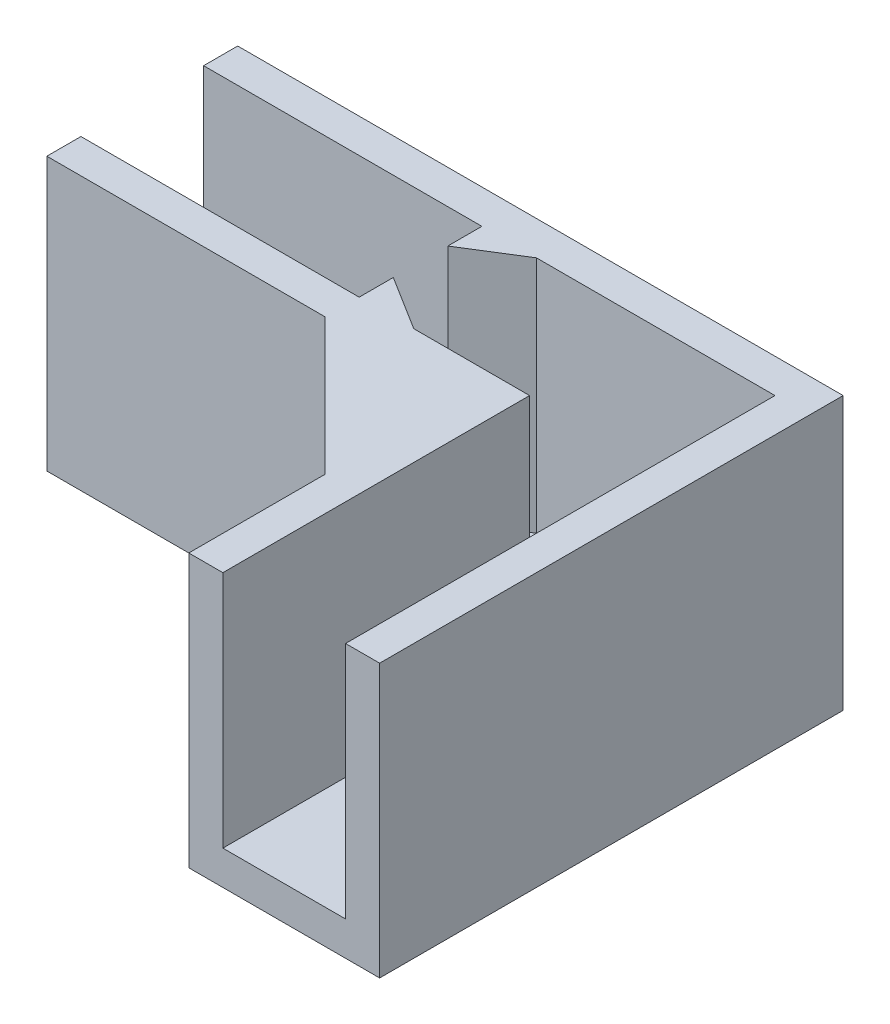
ISO-10303-21;
HEADER;
FILE_DESCRIPTION(('STEP AP214'),'2;1');
FILE_NAME('part.step','',(''),(''),'','','');
FILE_SCHEMA(('AUTOMOTIVE_DESIGN { 1 0 10303 214 1 1 1 1 }'));
ENDSEC;
DATA;
#1=APPLICATION_CONTEXT('core data for automotive mechanical design processes');
#2=APPLICATION_PROTOCOL_DEFINITION('international standard','automotive_design',2000,#1);
#3=PRODUCT_CONTEXT('',#1,'mechanical');
#4=PRODUCT('Part','Part','',(#3));
#5=PRODUCT_RELATED_PRODUCT_CATEGORY('part','',(#4));
#6=PRODUCT_DEFINITION_FORMATION('','',#4);
#7=PRODUCT_DEFINITION_CONTEXT('part definition',#1,'design');
#8=PRODUCT_DEFINITION('design','',#6,#7);
#9=PRODUCT_DEFINITION_SHAPE('','',#8);
#10=(LENGTH_UNIT() NAMED_UNIT(*) SI_UNIT(.MILLI.,.METRE.));
#11=(NAMED_UNIT(*) PLANE_ANGLE_UNIT() SI_UNIT($,.RADIAN.));
#12=(NAMED_UNIT(*) SI_UNIT($,.STERADIAN.) SOLID_ANGLE_UNIT());
#13=UNCERTAINTY_MEASURE_WITH_UNIT(LENGTH_MEASURE(1.E-05),#10,'distance_accuracy_value','');
#14=(GEOMETRIC_REPRESENTATION_CONTEXT(3) GLOBAL_UNCERTAINTY_ASSIGNED_CONTEXT((#13)) GLOBAL_UNIT_ASSIGNED_CONTEXT((#10,
#11,#12)) REPRESENTATION_CONTEXT('',''));
#15=CARTESIAN_POINT('',(0.,0.,0.));
#16=DIRECTION('',(0.,0.,1.));
#17=DIRECTION('',(1.,0.,0.));
#18=AXIS2_PLACEMENT_3D('',#15,#16,#17);
#19=CARTESIAN_POINT('',(-9.,5.,-9.));
#20=DIRECTION('',(0.,0.,-1.));
#21=DIRECTION('',(-1.,0.,0.));
#22=AXIS2_PLACEMENT_3D('',#19,#20,#21);
#23=PLANE('',#22);
#24=DIRECTION('',(-1.,0.,0.));
#25=VECTOR('',#24,1.);
#26=CARTESIAN_POINT('',(9.,5.,-9.));
#27=LINE('',#26,#25);
#28=CARTESIAN_POINT('',(-34.,5.,-9.));
#29=VERTEX_POINT('',#28);
#30=CARTESIAN_POINT('',(-74.8225344136131,5.,-8.99999999999998));
#31=VERTEX_POINT('',#30);
#32=EDGE_CURVE('E245',#29,#31,#27,.T.);
#33=ORIENTED_EDGE('',*,*,#32,.F.);
#34=DIRECTION('',(0.,1.,0.));
#35=VECTOR('',#34,1.);
#36=CARTESIAN_POINT('',(-34.,0.,-8.99999999999999));
#37=LINE('',#36,#35);
#38=CARTESIAN_POINT('',(-34.,40.,-8.99999999999999));
#39=VERTEX_POINT('',#38);
#40=EDGE_CURVE('E55',#29,#39,#37,.T.);
#41=ORIENTED_EDGE('',*,*,#40,.T.);
#42=DIRECTION('',(-1.,0.,0.));
#43=VECTOR('',#42,1.);
#44=CARTESIAN_POINT('',(-9.,40.,-9.));
#45=LINE('',#44,#43);
#46=CARTESIAN_POINT('',(-74.8225344136131,40.,-8.99999999999998));
#47=VERTEX_POINT('',#46);
#48=EDGE_CURVE('E191',#39,#47,#45,.T.);
#49=ORIENTED_EDGE('',*,*,#48,.T.);
#50=DIRECTION('',(0.,1.,0.));
#51=VECTOR('',#50,1.);
#52=CARTESIAN_POINT('',(-74.8225344136131,5.,-8.99999999999998));
#53=LINE('',#52,#51);
#54=EDGE_CURVE('E277',#31,#47,#53,.T.);
#55=ORIENTED_EDGE('',*,*,#54,.F.);
#56=EDGE_LOOP('',(#33,#41,#49,#55));
#57=FACE_BOUND('',#56,.T.);
#58=ADVANCED_FACE('F39',(#57),#23,.F.);
#59=CARTESIAN_POINT('',(-9.,5.,9.));
#60=DIRECTION('',(0.,0.,1.));
#61=DIRECTION('',(1.,0.,0.));
#62=AXIS2_PLACEMENT_3D('',#59,#60,#61);
#63=PLANE('',#62);
#64=DIRECTION('',(1.,0.,0.));
#65=VECTOR('',#64,1.);
#66=CARTESIAN_POINT('',(-9.,40.,9.));
#67=LINE('',#66,#65);
#68=CARTESIAN_POINT('',(-74.8225344136131,40.,9.00000000000001));
#69=VERTEX_POINT('',#68);
#70=CARTESIAN_POINT('',(-34.,40.,9.00000000000001));
#71=VERTEX_POINT('',#70);
#72=EDGE_CURVE('E238',#69,#71,#67,.T.);
#73=ORIENTED_EDGE('',*,*,#72,.T.);
#74=DIRECTION('',(0.,1.,0.));
#75=VECTOR('',#74,1.);
#76=CARTESIAN_POINT('',(-34.,0.,9.00000000000001));
#77=LINE('',#76,#75);
#78=CARTESIAN_POINT('',(-34.,5.,9.00000000000001));
#79=VERTEX_POINT('',#78);
#80=EDGE_CURVE('E208',#79,#71,#77,.T.);
#81=ORIENTED_EDGE('',*,*,#80,.F.);
#82=DIRECTION('',(1.,0.,0.));
#83=VECTOR('',#82,1.);
#84=CARTESIAN_POINT('',(-9.,5.,9.));
#85=LINE('',#84,#83);
#86=CARTESIAN_POINT('',(-74.8225344136131,5.,9.00000000000001));
#87=VERTEX_POINT('',#86);
#88=EDGE_CURVE('E253',#87,#79,#85,.T.);
#89=ORIENTED_EDGE('',*,*,#88,.F.);
#90=DIRECTION('',(0.,1.,0.));
#91=VECTOR('',#90,1.);
#92=CARTESIAN_POINT('',(-74.8225344136131,5.,9.00000000000001));
#93=LINE('',#92,#91);
#94=EDGE_CURVE('E274',#87,#69,#93,.T.);
#95=ORIENTED_EDGE('',*,*,#94,.T.);
#96=EDGE_LOOP('',(#73,#81,#89,#95));
#97=FACE_BOUND('',#96,.T.);
#98=ADVANCED_FACE('F377',(#97),#63,.F.);
#99=CARTESIAN_POINT('',(0.,40.,0.));
#100=DIRECTION('',(0.,1.,0.));
#101=DIRECTION('',(0.,0.,1.));
#102=AXIS2_PLACEMENT_3D('',#99,#100,#101);
#103=PLANE('',#102);
#104=DIRECTION('',(1.,0.,0.));
#105=VECTOR('',#104,1.);
#106=CARTESIAN_POINT('',(-14.,40.,14.));
#107=LINE('',#106,#105);
#108=CARTESIAN_POINT('',(-74.8225344136131,40.,14.));
#109=VERTEX_POINT('',#108);
#110=CARTESIAN_POINT('',(-34.,40.,14.));
#111=VERTEX_POINT('',#110);
#112=EDGE_CURVE('E299',#109,#111,#107,.T.);
#113=ORIENTED_EDGE('',*,*,#112,.T.);
#114=DIRECTION('',(0.707106781186548,0.,0.707106781186547));
#115=VECTOR('',#114,1.);
#116=CARTESIAN_POINT('',(-34.,40.,14.));
#117=LINE('',#116,#115);
#118=CARTESIAN_POINT('',(-14.,40.,34.));
#119=VERTEX_POINT('',#118);
#120=EDGE_CURVE('E212',#111,#119,#117,.T.);
#121=ORIENTED_EDGE('',*,*,#120,.T.);
#122=DIRECTION('',(0.,0.,1.));
#123=VECTOR('',#122,1.);
#124=CARTESIAN_POINT('',(-14.,40.,14.));
#125=LINE('',#124,#123);
#126=CARTESIAN_POINT('',(-14.,40.,54.));
#127=VERTEX_POINT('',#126);
#128=EDGE_CURVE('E303',#119,#127,#125,.T.);
#129=ORIENTED_EDGE('',*,*,#128,.T.);
#130=DIRECTION('',(1.,0.,0.));
#131=VECTOR('',#130,1.);
#132=CARTESIAN_POINT('',(-14.,40.,54.));
#133=LINE('',#132,#131);
#134=CARTESIAN_POINT('',(-9.,40.,54.));
#135=VERTEX_POINT('',#134);
#136=EDGE_CURVE('E307',#127,#135,#133,.T.);
#137=ORIENTED_EDGE('',*,*,#136,.T.);
#138=DIRECTION('',(0.,0.,1.));
#139=VECTOR('',#138,1.);
#140=CARTESIAN_POINT('',(-9.,40.,9.));
#141=LINE('',#140,#139);
#142=CARTESIAN_POINT('',(-9.,40.,9.));
#143=VERTEX_POINT('',#142);
#144=EDGE_CURVE('E230',#143,#135,#141,.T.);
#145=ORIENTED_EDGE('',*,*,#144,.F.);
#146=CARTESIAN_POINT('',(-26.,40.,9.00000000000001));
#147=VERTEX_POINT('',#146);
#148=EDGE_CURVE('E266',#147,#143,#67,.T.);
#149=ORIENTED_EDGE('',*,*,#148,.F.);
#150=DIRECTION('',(-0.847998304005088,0.,-0.52999894000318));
#151=VECTOR('',#150,1.);
#152=CARTESIAN_POINT('',(-34.,40.,4.00000000000001));
#153=LINE('',#152,#151);
#154=CARTESIAN_POINT('',(-34.,40.,4.00000000000001));
#155=VERTEX_POINT('',#154);
#156=EDGE_CURVE('E197',#147,#155,#153,.T.);
#157=ORIENTED_EDGE('',*,*,#156,.T.);
#158=DIRECTION('',(0.,0.,1.));
#159=VECTOR('',#158,1.);
#160=CARTESIAN_POINT('',(-34.,40.,9.00000000000001));
#161=LINE('',#160,#159);
#162=EDGE_CURVE('E203',#155,#71,#161,.T.);
#163=ORIENTED_EDGE('',*,*,#162,.T.);
#164=ORIENTED_EDGE('',*,*,#72,.F.);
#165=DIRECTION('',(0.,0.,1.));
#166=VECTOR('',#165,1.);
#167=CARTESIAN_POINT('',(-74.8225344136131,40.,-14.));
#168=LINE('',#167,#166);
#169=EDGE_CURVE('E294',#69,#109,#168,.T.);
#170=ORIENTED_EDGE('',*,*,#169,.T.);
#171=EDGE_LOOP('',(#113,#121,#129,#137,#145,#149,#157,#163,#164,#170));
#172=FACE_BOUND('',#171,.T.);
#173=ADVANCED_FACE('F382',(#172),#103,.T.);
#174=CARTESIAN_POINT('',(-74.8225344136131,40.,-14.));
#175=DIRECTION('',(1.,0.,0.));
#176=DIRECTION('',(0.,0.,-1.));
#177=AXIS2_PLACEMENT_3D('',#174,#175,#176);
#178=PLANE('',#177);
#179=ORIENTED_EDGE('',*,*,#169,.F.);
#180=ORIENTED_EDGE('',*,*,#94,.F.);
#181=DIRECTION('',(0.,0.,1.));
#182=VECTOR('',#181,1.);
#183=CARTESIAN_POINT('',(-74.8225344136131,5.,-8.99999999999998));
#184=LINE('',#183,#182);
#185=EDGE_CURVE('E249',#31,#87,#184,.T.);
#186=ORIENTED_EDGE('',*,*,#185,.F.);
#187=ORIENTED_EDGE('',*,*,#54,.T.);
#188=CARTESIAN_POINT('',(-74.8225344136131,40.,-14.));
#189=VERTEX_POINT('',#188);
#190=EDGE_CURVE('E296',#189,#47,#168,.T.);
#191=ORIENTED_EDGE('',*,*,#190,.F.);
#192=DIRECTION('',(0.,-1.,0.));
#193=VECTOR('',#192,1.);
#194=CARTESIAN_POINT('',(-74.8225344136131,40.,-14.));
#195=LINE('',#194,#193);
#196=CARTESIAN_POINT('',(-74.8225344136131,0.,-14.));
#197=VERTEX_POINT('',#196);
#198=EDGE_CURVE('E347',#189,#197,#195,.T.);
#199=ORIENTED_EDGE('',*,*,#198,.T.);
#200=DIRECTION('',(0.,0.,1.));
#201=VECTOR('',#200,1.);
#202=CARTESIAN_POINT('',(-74.8225344136131,0.,-14.));
#203=LINE('',#202,#201);
#204=CARTESIAN_POINT('',(-74.8225344136131,0.,14.));
#205=VERTEX_POINT('',#204);
#206=EDGE_CURVE('E273',#197,#205,#203,.T.);
#207=ORIENTED_EDGE('',*,*,#206,.T.);
#208=DIRECTION('',(0.,-1.,0.));
#209=VECTOR('',#208,1.);
#210=CARTESIAN_POINT('',(-74.8225344136131,40.,14.));
#211=LINE('',#210,#209);
#212=EDGE_CURVE('E343',#109,#205,#211,.T.);
#213=ORIENTED_EDGE('',*,*,#212,.F.);
#214=EDGE_LOOP('',(#179,#180,#186,#187,#191,#199,#207,#213));
#215=FACE_BOUND('',#214,.T.);
#216=ADVANCED_FACE('F41',(#215),#178,.F.);
#217=CARTESIAN_POINT('',(-14.,40.,14.));
#218=DIRECTION('',(0.,0.,-1.));
#219=DIRECTION('',(-1.,0.,0.));
#220=AXIS2_PLACEMENT_3D('',#217,#218,#219);
#221=PLANE('',#220);
#222=DIRECTION('',(1.,0.,0.));
#223=VECTOR('',#222,1.);
#224=CARTESIAN_POINT('',(-14.,0.,14.));
#225=LINE('',#224,#223);
#226=CARTESIAN_POINT('',(-34.,0.,14.));
#227=VERTEX_POINT('',#226);
#228=EDGE_CURVE('E317',#205,#227,#225,.T.);
#229=ORIENTED_EDGE('',*,*,#228,.T.);
#230=DIRECTION('',(0.,1.,0.));
#231=VECTOR('',#230,1.);
#232=CARTESIAN_POINT('',(-34.,0.,14.));
#233=LINE('',#232,#231);
#234=EDGE_CURVE('E222',#227,#111,#233,.T.);
#235=ORIENTED_EDGE('',*,*,#234,.T.);
#236=ORIENTED_EDGE('',*,*,#112,.F.);
#237=ORIENTED_EDGE('',*,*,#212,.T.);
#238=EDGE_LOOP('',(#229,#235,#236,#237));
#239=FACE_BOUND('',#238,.T.);
#240=ADVANCED_FACE('F405',(#239),#221,.F.);
#241=CARTESIAN_POINT('',(-14.,40.,14.));
#242=DIRECTION('',(1.,0.,0.));
#243=DIRECTION('',(0.,0.,-1.));
#244=AXIS2_PLACEMENT_3D('',#241,#242,#243);
#245=PLANE('',#244);
#246=ORIENTED_EDGE('',*,*,#128,.F.);
#247=DIRECTION('',(0.,1.,0.));
#248=VECTOR('',#247,1.);
#249=CARTESIAN_POINT('',(-14.,0.,34.));
#250=LINE('',#249,#248);
#251=CARTESIAN_POINT('',(-14.,0.,34.));
#252=VERTEX_POINT('',#251);
#253=EDGE_CURVE('E226',#252,#119,#250,.T.);
#254=ORIENTED_EDGE('',*,*,#253,.F.);
#255=DIRECTION('',(0.,0.,1.));
#256=VECTOR('',#255,1.);
#257=CARTESIAN_POINT('',(-14.,0.,14.));
#258=LINE('',#257,#256);
#259=CARTESIAN_POINT('',(-14.,0.,54.));
#260=VERTEX_POINT('',#259);
#261=EDGE_CURVE('E320',#252,#260,#258,.T.);
#262=ORIENTED_EDGE('',*,*,#261,.T.);
#263=DIRECTION('',(0.,-1.,0.));
#264=VECTOR('',#263,1.);
#265=CARTESIAN_POINT('',(-14.,40.,54.));
#266=LINE('',#265,#264);
#267=EDGE_CURVE('E339',#127,#260,#266,.T.);
#268=ORIENTED_EDGE('',*,*,#267,.F.);
#269=EDGE_LOOP('',(#246,#254,#262,#268));
#270=FACE_BOUND('',#269,.T.);
#271=ADVANCED_FACE('F432',(#270),#245,.F.);
#272=CARTESIAN_POINT('',(-14.,40.,54.));
#273=DIRECTION('',(0.,0.,-1.));
#274=DIRECTION('',(-1.,0.,0.));
#275=AXIS2_PLACEMENT_3D('',#272,#273,#274);
#276=PLANE('',#275);
#277=DIRECTION('',(1.,0.,0.));
#278=VECTOR('',#277,1.);
#279=CARTESIAN_POINT('',(-9.,5.,54.));
#280=LINE('',#279,#278);
#281=CARTESIAN_POINT('',(-9.,5.,54.));
#282=VERTEX_POINT('',#281);
#283=CARTESIAN_POINT('',(9.,5.,54.));
#284=VERTEX_POINT('',#283);
#285=EDGE_CURVE('E237',#282,#284,#280,.T.);
#286=ORIENTED_EDGE('',*,*,#285,.F.);
#287=DIRECTION('',(0.,1.,0.));
#288=VECTOR('',#287,1.);
#289=CARTESIAN_POINT('',(-9.,5.,54.));
#290=LINE('',#289,#288);
#291=EDGE_CURVE('E257',#282,#135,#290,.T.);
#292=ORIENTED_EDGE('',*,*,#291,.T.);
#293=ORIENTED_EDGE('',*,*,#136,.F.);
#294=ORIENTED_EDGE('',*,*,#267,.T.);
#295=DIRECTION('',(1.,0.,0.));
#296=VECTOR('',#295,1.);
#297=CARTESIAN_POINT('',(-14.,0.,54.));
#298=LINE('',#297,#296);
#299=CARTESIAN_POINT('',(14.,0.,54.));
#300=VERTEX_POINT('',#299);
#301=EDGE_CURVE('E323',#260,#300,#298,.T.);
#302=ORIENTED_EDGE('',*,*,#301,.T.);
#303=DIRECTION('',(0.,-1.,0.));
#304=VECTOR('',#303,1.);
#305=CARTESIAN_POINT('',(14.,40.,54.));
#306=LINE('',#305,#304);
#307=CARTESIAN_POINT('',(14.,40.,54.));
#308=VERTEX_POINT('',#307);
#309=EDGE_CURVE('E335',#308,#300,#306,.T.);
#310=ORIENTED_EDGE('',*,*,#309,.F.);
#311=CARTESIAN_POINT('',(9.,40.,54.));
#312=VERTEX_POINT('',#311);
#313=EDGE_CURVE('E306',#312,#308,#133,.T.);
#314=ORIENTED_EDGE('',*,*,#313,.F.);
#315=DIRECTION('',(0.,1.,0.));
#316=VECTOR('',#315,1.);
#317=CARTESIAN_POINT('',(9.,5.,54.));
#318=LINE('',#317,#316);
#319=EDGE_CURVE('E284',#284,#312,#318,.T.);
#320=ORIENTED_EDGE('',*,*,#319,.F.);
#321=EDGE_LOOP('',(#286,#292,#293,#294,#302,#310,#314,#320));
#322=FACE_BOUND('',#321,.T.);
#323=ADVANCED_FACE('F428',(#322),#276,.F.);
#324=CARTESIAN_POINT('',(14.,40.,14.));
#325=DIRECTION('',(-1.,0.,0.));
#326=DIRECTION('',(0.,0.,1.));
#327=AXIS2_PLACEMENT_3D('',#324,#325,#326);
#328=PLANE('',#327);
#329=DIRECTION('',(0.,0.,-1.));
#330=VECTOR('',#329,1.);
#331=CARTESIAN_POINT('',(14.,0.,14.));
#332=LINE('',#331,#330);
#333=CARTESIAN_POINT('',(14.,0.,-14.));
#334=VERTEX_POINT('',#333);
#335=EDGE_CURVE('E327',#300,#334,#332,.T.);
#336=ORIENTED_EDGE('',*,*,#335,.T.);
#337=DIRECTION('',(0.,-1.,0.));
#338=VECTOR('',#337,1.);
#339=CARTESIAN_POINT('',(14.,40.,-14.));
#340=LINE('',#339,#338);
#341=CARTESIAN_POINT('',(14.,40.,-14.));
#342=VERTEX_POINT('',#341);
#343=EDGE_CURVE('E314',#342,#334,#340,.T.);
#344=ORIENTED_EDGE('',*,*,#343,.F.);
#345=DIRECTION('',(0.,0.,-1.));
#346=VECTOR('',#345,1.);
#347=CARTESIAN_POINT('',(14.,40.,14.));
#348=LINE('',#347,#346);
#349=EDGE_CURVE('E311',#308,#342,#348,.T.);
#350=ORIENTED_EDGE('',*,*,#349,.F.);
#351=ORIENTED_EDGE('',*,*,#309,.T.);
#352=EDGE_LOOP('',(#336,#344,#350,#351));
#353=FACE_BOUND('',#352,.T.);
#354=ADVANCED_FACE('F435',(#353),#328,.F.);
#355=CARTESIAN_POINT('',(14.,40.,-14.));
#356=DIRECTION('',(0.,0.,1.));
#357=DIRECTION('',(1.,0.,0.));
#358=AXIS2_PLACEMENT_3D('',#355,#356,#357);
#359=PLANE('',#358);
#360=DIRECTION('',(-1.,0.,0.));
#361=VECTOR('',#360,1.);
#362=CARTESIAN_POINT('',(14.,0.,-14.));
#363=LINE('',#362,#361);
#364=EDGE_CURVE('E295',#334,#197,#363,.T.);
#365=ORIENTED_EDGE('',*,*,#364,.T.);
#366=ORIENTED_EDGE('',*,*,#198,.F.);
#367=DIRECTION('',(-1.,0.,0.));
#368=VECTOR('',#367,1.);
#369=CARTESIAN_POINT('',(-14.,40.,-14.));
#370=LINE('',#369,#368);
#371=EDGE_CURVE('E290',#342,#189,#370,.T.);
#372=ORIENTED_EDGE('',*,*,#371,.F.);
#373=ORIENTED_EDGE('',*,*,#343,.T.);
#374=EDGE_LOOP('',(#365,#366,#372,#373));
#375=FACE_BOUND('',#374,.T.);
#376=ADVANCED_FACE('F397',(#375),#359,.F.);
#377=CARTESIAN_POINT('',(9.,40.,-9.));
#378=VERTEX_POINT('',#377);
#379=CARTESIAN_POINT('',(-26.,40.,-8.99999999999999));
#380=VERTEX_POINT('',#379);
#381=EDGE_CURVE('E63',#378,#380,#45,.T.);
#382=ORIENTED_EDGE('',*,*,#381,.F.);
#383=DIRECTION('',(0.,0.,-1.));
#384=VECTOR('',#383,1.);
#385=CARTESIAN_POINT('',(9.,40.,-9.));
#386=LINE('',#385,#384);
#387=EDGE_CURVE('E260',#312,#378,#386,.T.);
#388=ORIENTED_EDGE('',*,*,#387,.F.);
#389=ORIENTED_EDGE('',*,*,#313,.T.);
#390=ORIENTED_EDGE('',*,*,#349,.T.);
#391=ORIENTED_EDGE('',*,*,#371,.T.);
#392=ORIENTED_EDGE('',*,*,#190,.T.);
#393=ORIENTED_EDGE('',*,*,#48,.F.);
#394=DIRECTION('',(0.,0.,1.));
#395=VECTOR('',#394,1.);
#396=CARTESIAN_POINT('',(-34.,40.,-8.99999999999999));
#397=LINE('',#396,#395);
#398=CARTESIAN_POINT('',(-34.,40.,-3.99999999999999));
#399=VERTEX_POINT('',#398);
#400=EDGE_CURVE('E177',#39,#399,#397,.T.);
#401=ORIENTED_EDGE('',*,*,#400,.T.);
#402=DIRECTION('',(0.847998304005088,0.,-0.52999894000318));
#403=VECTOR('',#402,1.);
#404=CARTESIAN_POINT('',(-34.,40.,-3.99999999999999));
#405=LINE('',#404,#403);
#406=EDGE_CURVE('E182',#399,#380,#405,.T.);
#407=ORIENTED_EDGE('',*,*,#406,.T.);
#408=EDGE_LOOP('',(#382,#388,#389,#390,#391,#392,#393,#401,#407));
#409=FACE_BOUND('',#408,.T.);
#410=ADVANCED_FACE('F189',(#409),#103,.T.);
#411=CARTESIAN_POINT('',(0.,0.,0.));
#412=DIRECTION('',(0.,1.,0.));
#413=DIRECTION('',(0.,0.,1.));
#414=AXIS2_PLACEMENT_3D('',#411,#412,#413);
#415=PLANE('',#414);
#416=DIRECTION('',(0.707106781186548,0.,0.707106781186547));
#417=VECTOR('',#416,1.);
#418=CARTESIAN_POINT('',(-34.,0.,14.));
#419=LINE('',#418,#417);
#420=EDGE_CURVE('E218',#227,#252,#419,.T.);
#421=ORIENTED_EDGE('',*,*,#420,.F.);
#422=ORIENTED_EDGE('',*,*,#228,.F.);
#423=ORIENTED_EDGE('',*,*,#206,.F.);
#424=ORIENTED_EDGE('',*,*,#364,.F.);
#425=ORIENTED_EDGE('',*,*,#335,.F.);
#426=ORIENTED_EDGE('',*,*,#301,.F.);
#427=ORIENTED_EDGE('',*,*,#261,.F.);
#428=EDGE_LOOP('',(#421,#422,#423,#424,#425,#426,#427));
#429=FACE_BOUND('',#428,.T.);
#430=ADVANCED_FACE('F408',(#429),#415,.F.);
#431=CARTESIAN_POINT('',(-9.,5.,9.));
#432=DIRECTION('',(-1.,0.,0.));
#433=DIRECTION('',(0.,0.,1.));
#434=AXIS2_PLACEMENT_3D('',#431,#432,#433);
#435=PLANE('',#434);
#436=ORIENTED_EDGE('',*,*,#144,.T.);
#437=ORIENTED_EDGE('',*,*,#291,.F.);
#438=DIRECTION('',(0.,0.,1.));
#439=VECTOR('',#438,1.);
#440=CARTESIAN_POINT('',(-9.,5.,9.));
#441=LINE('',#440,#439);
#442=CARTESIAN_POINT('',(-9.,5.,9.));
#443=VERTEX_POINT('',#442);
#444=EDGE_CURVE('E233',#443,#282,#441,.T.);
#445=ORIENTED_EDGE('',*,*,#444,.F.);
#446=DIRECTION('',(0.,1.,0.));
#447=VECTOR('',#446,1.);
#448=CARTESIAN_POINT('',(-9.,5.,9.));
#449=LINE('',#448,#447);
#450=EDGE_CURVE('E269',#443,#143,#449,.T.);
#451=ORIENTED_EDGE('',*,*,#450,.T.);
#452=EDGE_LOOP('',(#436,#437,#445,#451));
#453=FACE_BOUND('',#452,.T.);
#454=ADVANCED_FACE('F374',(#453),#435,.F.);
#455=CARTESIAN_POINT('',(-26.,5.,9.00000000000001));
#456=VERTEX_POINT('',#455);
#457=EDGE_CURVE('E252',#456,#443,#85,.T.);
#458=ORIENTED_EDGE('',*,*,#457,.F.);
#459=DIRECTION('',(0.,1.,0.));
#460=VECTOR('',#459,1.);
#461=CARTESIAN_POINT('',(-26.,0.,9.00000000000001));
#462=LINE('',#461,#460);
#463=EDGE_CURVE('E207',#456,#147,#462,.T.);
#464=ORIENTED_EDGE('',*,*,#463,.T.);
#465=ORIENTED_EDGE('',*,*,#148,.T.);
#466=ORIENTED_EDGE('',*,*,#450,.F.);
#467=EDGE_LOOP('',(#458,#464,#465,#466));
#468=FACE_BOUND('',#467,.T.);
#469=ADVANCED_FACE('F366',(#468),#63,.F.);
#470=ORIENTED_EDGE('',*,*,#381,.T.);
#471=DIRECTION('',(0.,1.,0.));
#472=VECTOR('',#471,1.);
#473=CARTESIAN_POINT('',(-26.,0.,-8.99999999999999));
#474=LINE('',#473,#472);
#475=CARTESIAN_POINT('',(-26.,5.,-8.99999999999999));
#476=VERTEX_POINT('',#475);
#477=EDGE_CURVE('E181',#476,#380,#474,.T.);
#478=ORIENTED_EDGE('',*,*,#477,.F.);
#479=CARTESIAN_POINT('',(9.,5.,-9.));
#480=VERTEX_POINT('',#479);
#481=EDGE_CURVE('E246',#480,#476,#27,.T.);
#482=ORIENTED_EDGE('',*,*,#481,.F.);
#483=DIRECTION('',(0.,1.,0.));
#484=VECTOR('',#483,1.);
#485=CARTESIAN_POINT('',(9.,5.,-9.));
#486=LINE('',#485,#484);
#487=EDGE_CURVE('E281',#480,#378,#486,.T.);
#488=ORIENTED_EDGE('',*,*,#487,.T.);
#489=EDGE_LOOP('',(#470,#478,#482,#488));
#490=FACE_BOUND('',#489,.T.);
#491=ADVANCED_FACE('F363',(#490),#23,.F.);
#492=CARTESIAN_POINT('',(9.,5.,-9.));
#493=DIRECTION('',(1.,0.,0.));
#494=DIRECTION('',(0.,0.,-1.));
#495=AXIS2_PLACEMENT_3D('',#492,#493,#494);
#496=PLANE('',#495);
#497=ORIENTED_EDGE('',*,*,#387,.T.);
#498=ORIENTED_EDGE('',*,*,#487,.F.);
#499=DIRECTION('',(0.,0.,-1.));
#500=VECTOR('',#499,1.);
#501=CARTESIAN_POINT('',(9.,5.,9.));
#502=LINE('',#501,#500);
#503=EDGE_CURVE('E242',#284,#480,#502,.T.);
#504=ORIENTED_EDGE('',*,*,#503,.F.);
#505=ORIENTED_EDGE('',*,*,#319,.T.);
#506=EDGE_LOOP('',(#497,#498,#504,#505));
#507=FACE_BOUND('',#506,.T.);
#508=ADVANCED_FACE('F365',(#507),#496,.F.);
#509=CARTESIAN_POINT('',(0.,5.,0.));
#510=DIRECTION('',(0.,1.,0.));
#511=DIRECTION('',(0.,0.,1.));
#512=AXIS2_PLACEMENT_3D('',#509,#510,#511);
#513=PLANE('',#512);
#514=DIRECTION('',(0.,0.,1.));
#515=VECTOR('',#514,1.);
#516=CARTESIAN_POINT('',(-34.,5.,0.));
#517=LINE('',#516,#515);
#518=CARTESIAN_POINT('',(-34.,5.,-3.99999999999999));
#519=VERTEX_POINT('',#518);
#520=EDGE_CURVE('E11',#29,#519,#517,.T.);
#521=ORIENTED_EDGE('',*,*,#520,.F.);
#522=ORIENTED_EDGE('',*,*,#32,.T.);
#523=ORIENTED_EDGE('',*,*,#185,.T.);
#524=ORIENTED_EDGE('',*,*,#88,.T.);
#525=DIRECTION('',(0.,0.,1.));
#526=VECTOR('',#525,1.);
#527=CARTESIAN_POINT('',(-34.,5.,0.));
#528=LINE('',#527,#526);
#529=CARTESIAN_POINT('',(-34.,5.,4.00000000000001));
#530=VERTEX_POINT('',#529);
#531=EDGE_CURVE('E355',#530,#79,#528,.T.);
#532=ORIENTED_EDGE('',*,*,#531,.F.);
#533=DIRECTION('',(-0.847998304005088,0.,-0.52999894000318));
#534=VECTOR('',#533,1.);
#535=CARTESIAN_POINT('',(-11.3483146067416,5.,18.1573033707865));
#536=LINE('',#535,#534);
#537=EDGE_CURVE('E351',#456,#530,#536,.T.);
#538=ORIENTED_EDGE('',*,*,#537,.F.);
#539=ORIENTED_EDGE('',*,*,#457,.T.);
#540=ORIENTED_EDGE('',*,*,#444,.T.);
#541=ORIENTED_EDGE('',*,*,#285,.T.);
#542=ORIENTED_EDGE('',*,*,#503,.T.);
#543=ORIENTED_EDGE('',*,*,#481,.T.);
#544=DIRECTION('',(0.847998304005088,0.,-0.52999894000318));
#545=VECTOR('',#544,1.);
#546=CARTESIAN_POINT('',(-11.3483146067416,5.,-18.1573033707865));
#547=LINE('',#546,#545);
#548=EDGE_CURVE('E48',#519,#476,#547,.T.);
#549=ORIENTED_EDGE('',*,*,#548,.F.);
#550=EDGE_LOOP('',(#521,#522,#523,#524,#532,#538,#539,#540,#541,#542,#543,#549));
#551=FACE_BOUND('',#550,.T.);
#552=ADVANCED_FACE('F360',(#551),#513,.T.);
#553=CARTESIAN_POINT('',(-34.,0.,14.));
#554=DIRECTION('',(-0.707106781186547,0.,0.707106781186548));
#555=DIRECTION('',(0.707106781186548,0.,0.707106781186547));
#556=AXIS2_PLACEMENT_3D('',#553,#554,#555);
#557=PLANE('',#556);
#558=ORIENTED_EDGE('',*,*,#120,.F.);
#559=ORIENTED_EDGE('',*,*,#234,.F.);
#560=ORIENTED_EDGE('',*,*,#420,.T.);
#561=ORIENTED_EDGE('',*,*,#253,.T.);
#562=EDGE_LOOP('',(#558,#559,#560,#561));
#563=FACE_BOUND('',#562,.T.);
#564=ADVANCED_FACE('F413',(#563),#557,.T.);
#565=CARTESIAN_POINT('',(-34.,0.,9.00000000000001));
#566=DIRECTION('',(-1.,0.,0.));
#567=DIRECTION('',(0.,0.,1.));
#568=AXIS2_PLACEMENT_3D('',#565,#566,#567);
#569=PLANE('',#568);
#570=DIRECTION('',(0.,1.,0.));
#571=VECTOR('',#570,1.);
#572=CARTESIAN_POINT('',(-34.,0.,4.00000000000001));
#573=LINE('',#572,#571);
#574=EDGE_CURVE('E213',#530,#155,#573,.T.);
#575=ORIENTED_EDGE('',*,*,#574,.F.);
#576=ORIENTED_EDGE('',*,*,#531,.T.);
#577=ORIENTED_EDGE('',*,*,#80,.T.);
#578=ORIENTED_EDGE('',*,*,#162,.F.);
#579=EDGE_LOOP('',(#575,#576,#577,#578));
#580=FACE_BOUND('',#579,.T.);
#581=ADVANCED_FACE('F503',(#580),#569,.T.);
#582=CARTESIAN_POINT('',(-34.,0.,4.00000000000001));
#583=DIRECTION('',(0.52999894000318,0.,-0.847998304005088));
#584=DIRECTION('',(-0.847998304005088,0.,-0.52999894000318));
#585=AXIS2_PLACEMENT_3D('',#582,#583,#584);
#586=PLANE('',#585);
#587=ORIENTED_EDGE('',*,*,#463,.F.);
#588=ORIENTED_EDGE('',*,*,#537,.T.);
#589=ORIENTED_EDGE('',*,*,#574,.T.);
#590=ORIENTED_EDGE('',*,*,#156,.F.);
#591=EDGE_LOOP('',(#587,#588,#589,#590));
#592=FACE_BOUND('',#591,.T.);
#593=ADVANCED_FACE('F512',(#592),#586,.T.);
#594=CARTESIAN_POINT('',(-34.,0.,-8.99999999999999));
#595=DIRECTION('',(-1.,0.,0.));
#596=DIRECTION('',(0.,0.,1.));
#597=AXIS2_PLACEMENT_3D('',#594,#595,#596);
#598=PLANE('',#597);
#599=ORIENTED_EDGE('',*,*,#40,.F.);
#600=ORIENTED_EDGE('',*,*,#520,.T.);
#601=DIRECTION('',(0.,1.,0.));
#602=VECTOR('',#601,1.);
#603=CARTESIAN_POINT('',(-34.,0.,-3.99999999999999));
#604=LINE('',#603,#602);
#605=EDGE_CURVE('E173',#519,#399,#604,.T.);
#606=ORIENTED_EDGE('',*,*,#605,.T.);
#607=ORIENTED_EDGE('',*,*,#400,.F.);
#608=EDGE_LOOP('',(#599,#600,#606,#607));
#609=FACE_BOUND('',#608,.T.);
#610=ADVANCED_FACE('F175',(#609),#598,.T.);
#611=CARTESIAN_POINT('',(-34.,0.,-3.99999999999999));
#612=DIRECTION('',(0.52999894000318,0.,0.847998304005088));
#613=DIRECTION('',(0.847998304005088,0.,-0.52999894000318));
#614=AXIS2_PLACEMENT_3D('',#611,#612,#613);
#615=PLANE('',#614);
#616=ORIENTED_EDGE('',*,*,#605,.F.);
#617=ORIENTED_EDGE('',*,*,#548,.T.);
#618=ORIENTED_EDGE('',*,*,#477,.T.);
#619=ORIENTED_EDGE('',*,*,#406,.F.);
#620=EDGE_LOOP('',(#616,#617,#618,#619));
#621=FACE_BOUND('',#620,.T.);
#622=ADVANCED_FACE('F185',(#621),#615,.T.);
#623=CLOSED_SHELL('',(#58,#98,#173,#216,#240,#271,#323,#354,#376,#410,#430,#454,#469,#491,#508,
#552,#564,#581,#593,#610,#622));
#624=MANIFOLD_SOLID_BREP('B2',#623);
#625=ADVANCED_BREP_SHAPE_REPRESENTATION('',(#18,#624),#14);
#626=SHAPE_DEFINITION_REPRESENTATION(#9,#625);
ENDSEC;
END-ISO-10303-21;
